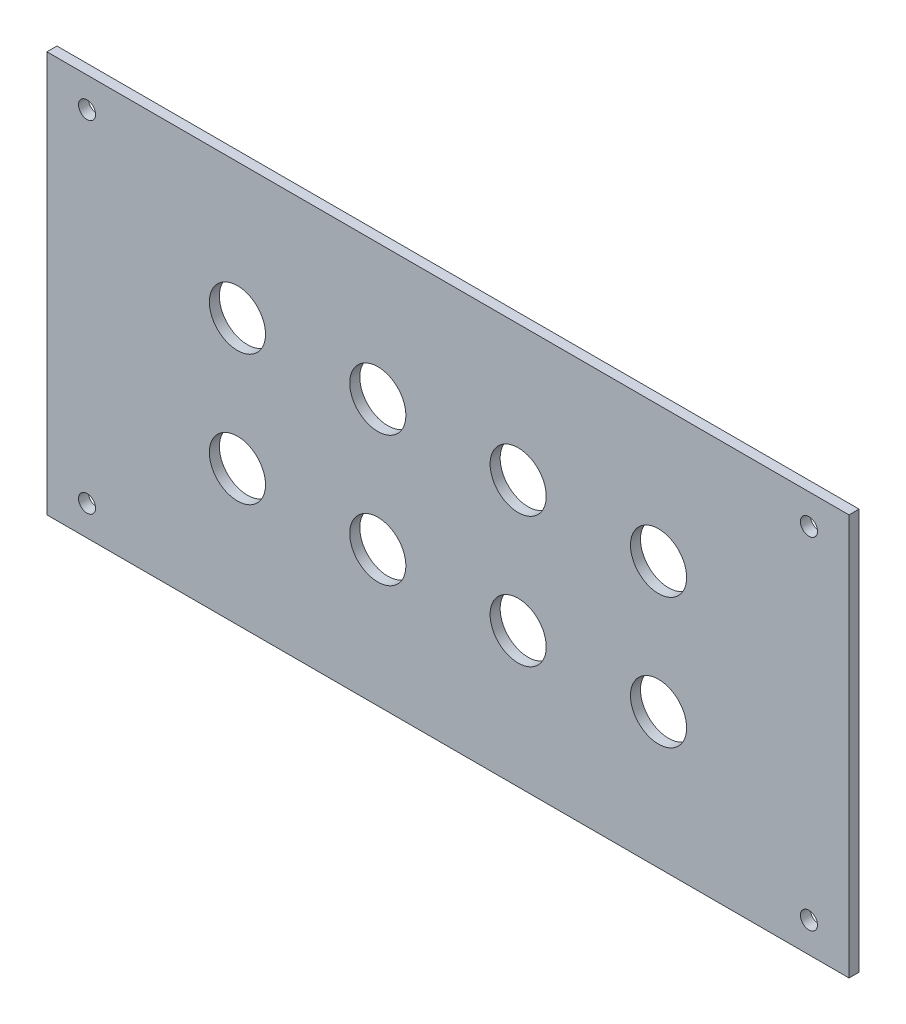
ISO-10303-21;
HEADER;
FILE_DESCRIPTION(('STEP AP214'),'2;1');
FILE_NAME('part.step','',(''),(''),'','','');
FILE_SCHEMA(('AUTOMOTIVE_DESIGN { 1 0 10303 214 1 1 1 1 }'));
ENDSEC;
DATA;
#1=APPLICATION_CONTEXT('core data for automotive mechanical design processes');
#2=APPLICATION_PROTOCOL_DEFINITION('international standard','automotive_design',2000,#1);
#3=PRODUCT_CONTEXT('',#1,'mechanical');
#4=PRODUCT('Part','Part','',(#3));
#5=PRODUCT_RELATED_PRODUCT_CATEGORY('part','',(#4));
#6=PRODUCT_DEFINITION_FORMATION('','',#4);
#7=PRODUCT_DEFINITION_CONTEXT('part definition',#1,'design');
#8=PRODUCT_DEFINITION('design','',#6,#7);
#9=PRODUCT_DEFINITION_SHAPE('','',#8);
#10=(LENGTH_UNIT() NAMED_UNIT(*) SI_UNIT(.MILLI.,.METRE.));
#11=(NAMED_UNIT(*) PLANE_ANGLE_UNIT() SI_UNIT($,.RADIAN.));
#12=(NAMED_UNIT(*) SI_UNIT($,.STERADIAN.) SOLID_ANGLE_UNIT());
#13=UNCERTAINTY_MEASURE_WITH_UNIT(LENGTH_MEASURE(1.E-05),#10,'distance_accuracy_value','');
#14=(GEOMETRIC_REPRESENTATION_CONTEXT(3) GLOBAL_UNCERTAINTY_ASSIGNED_CONTEXT((#13)) GLOBAL_UNIT_ASSIGNED_CONTEXT((#10,
#11,#12)) REPRESENTATION_CONTEXT('',''));
#15=CARTESIAN_POINT('',(0.,0.,0.));
#16=DIRECTION('',(0.,0.,1.));
#17=DIRECTION('',(1.,0.,0.));
#18=AXIS2_PLACEMENT_3D('',#15,#16,#17);
#19=CARTESIAN_POINT('',(0.,0.,2.));
#20=DIRECTION('',(0.,0.,1.));
#21=DIRECTION('',(1.,0.,0.));
#22=AXIS2_PLACEMENT_3D('',#19,#20,#21);
#23=PLANE('',#22);
#24=CARTESIAN_POINT('',(72.,34.,2.));
#25=DIRECTION('',(0.,0.,1.));
#26=DIRECTION('',(1.,0.,0.));
#27=AXIS2_PLACEMENT_3D('',#24,#25,#26);
#28=CIRCLE('',#27,1.7);
#29=CARTESIAN_POINT('',(73.7,34.,2.));
#30=VERTEX_POINT('',#29);
#31=EDGE_CURVE('E134',#30,#30,#28,.T.);
#32=ORIENTED_EDGE('',*,*,#31,.F.);
#33=EDGE_LOOP('',(#32));
#34=FACE_BOUND('',#33,.T.);
#35=CARTESIAN_POINT('',(72.,-34.,2.));
#36=DIRECTION('',(0.,0.,1.));
#37=DIRECTION('',(1.,0.,0.));
#38=AXIS2_PLACEMENT_3D('',#35,#36,#37);
#39=CIRCLE('',#38,1.7);
#40=CARTESIAN_POINT('',(73.7,-34.,2.));
#41=VERTEX_POINT('',#40);
#42=EDGE_CURVE('E131',#41,#41,#39,.T.);
#43=ORIENTED_EDGE('',*,*,#42,.F.);
#44=EDGE_LOOP('',(#43));
#45=FACE_BOUND('',#44,.T.);
#46=CARTESIAN_POINT('',(-72.,34.,2.));
#47=DIRECTION('',(0.,0.,1.));
#48=DIRECTION('',(1.,0.,0.));
#49=AXIS2_PLACEMENT_3D('',#46,#47,#48);
#50=CIRCLE('',#49,1.7);
#51=CARTESIAN_POINT('',(-70.3,34.,2.));
#52=VERTEX_POINT('',#51);
#53=EDGE_CURVE('E128',#52,#52,#50,.T.);
#54=ORIENTED_EDGE('',*,*,#53,.F.);
#55=EDGE_LOOP('',(#54));
#56=FACE_BOUND('',#55,.T.);
#57=CARTESIAN_POINT('',(-72.,-34.,2.));
#58=DIRECTION('',(0.,0.,1.));
#59=DIRECTION('',(1.,0.,0.));
#60=AXIS2_PLACEMENT_3D('',#57,#58,#59);
#61=CIRCLE('',#60,1.7);
#62=CARTESIAN_POINT('',(-70.3,-34.,2.));
#63=VERTEX_POINT('',#62);
#64=EDGE_CURVE('E124',#63,#63,#61,.T.);
#65=ORIENTED_EDGE('',*,*,#64,.F.);
#66=EDGE_LOOP('',(#65));
#67=FACE_BOUND('',#66,.T.);
#68=CARTESIAN_POINT('',(42.,13.,2.));
#69=DIRECTION('',(0.,0.,1.));
#70=DIRECTION('',(1.,0.,0.));
#71=AXIS2_PLACEMENT_3D('',#68,#69,#70);
#72=CIRCLE('',#71,5.6);
#73=CARTESIAN_POINT('',(47.6,13.,2.));
#74=VERTEX_POINT('',#73);
#75=EDGE_CURVE('E120',#74,#74,#72,.T.);
#76=ORIENTED_EDGE('',*,*,#75,.F.);
#77=EDGE_LOOP('',(#76));
#78=FACE_BOUND('',#77,.T.);
#79=CARTESIAN_POINT('',(14.,13.,2.));
#80=DIRECTION('',(0.,0.,1.));
#81=DIRECTION('',(1.,0.,0.));
#82=AXIS2_PLACEMENT_3D('',#79,#80,#81);
#83=CIRCLE('',#82,5.6);
#84=CARTESIAN_POINT('',(19.6,13.,2.));
#85=VERTEX_POINT('',#84);
#86=EDGE_CURVE('E116',#85,#85,#83,.T.);
#87=ORIENTED_EDGE('',*,*,#86,.F.);
#88=EDGE_LOOP('',(#87));
#89=FACE_BOUND('',#88,.T.);
#90=CARTESIAN_POINT('',(-14.,13.,2.));
#91=DIRECTION('',(0.,0.,1.));
#92=DIRECTION('',(1.,0.,0.));
#93=AXIS2_PLACEMENT_3D('',#90,#91,#92);
#94=CIRCLE('',#93,5.6);
#95=CARTESIAN_POINT('',(-8.4,13.,2.));
#96=VERTEX_POINT('',#95);
#97=EDGE_CURVE('E112',#96,#96,#94,.T.);
#98=ORIENTED_EDGE('',*,*,#97,.F.);
#99=EDGE_LOOP('',(#98));
#100=FACE_BOUND('',#99,.T.);
#101=CARTESIAN_POINT('',(-42.,13.,2.));
#102=DIRECTION('',(0.,0.,1.));
#103=DIRECTION('',(1.,0.,0.));
#104=AXIS2_PLACEMENT_3D('',#101,#102,#103);
#105=CIRCLE('',#104,5.6);
#106=CARTESIAN_POINT('',(-36.4,13.,2.));
#107=VERTEX_POINT('',#106);
#108=EDGE_CURVE('E108',#107,#107,#105,.T.);
#109=ORIENTED_EDGE('',*,*,#108,.F.);
#110=EDGE_LOOP('',(#109));
#111=FACE_BOUND('',#110,.T.);
#112=CARTESIAN_POINT('',(42.,-13.,2.));
#113=DIRECTION('',(0.,0.,1.));
#114=DIRECTION('',(1.,0.,0.));
#115=AXIS2_PLACEMENT_3D('',#112,#113,#114);
#116=CIRCLE('',#115,5.6);
#117=CARTESIAN_POINT('',(47.6,-13.,2.));
#118=VERTEX_POINT('',#117);
#119=EDGE_CURVE('E104',#118,#118,#116,.T.);
#120=ORIENTED_EDGE('',*,*,#119,.F.);
#121=EDGE_LOOP('',(#120));
#122=FACE_BOUND('',#121,.T.);
#123=CARTESIAN_POINT('',(14.,-13.,2.));
#124=DIRECTION('',(0.,0.,1.));
#125=DIRECTION('',(1.,0.,0.));
#126=AXIS2_PLACEMENT_3D('',#123,#124,#125);
#127=CIRCLE('',#126,5.6);
#128=CARTESIAN_POINT('',(19.6,-13.,2.));
#129=VERTEX_POINT('',#128);
#130=EDGE_CURVE('E100',#129,#129,#127,.T.);
#131=ORIENTED_EDGE('',*,*,#130,.F.);
#132=EDGE_LOOP('',(#131));
#133=FACE_BOUND('',#132,.T.);
#134=CARTESIAN_POINT('',(-14.,-13.,2.));
#135=DIRECTION('',(0.,0.,1.));
#136=DIRECTION('',(1.,0.,0.));
#137=AXIS2_PLACEMENT_3D('',#134,#135,#136);
#138=CIRCLE('',#137,5.6);
#139=CARTESIAN_POINT('',(-8.4,-13.,2.));
#140=VERTEX_POINT('',#139);
#141=EDGE_CURVE('E96',#140,#140,#138,.T.);
#142=ORIENTED_EDGE('',*,*,#141,.F.);
#143=EDGE_LOOP('',(#142));
#144=FACE_BOUND('',#143,.T.);
#145=CARTESIAN_POINT('',(-42.,-13.,2.));
#146=DIRECTION('',(0.,0.,1.));
#147=DIRECTION('',(1.,0.,0.));
#148=AXIS2_PLACEMENT_3D('',#145,#146,#147);
#149=CIRCLE('',#148,5.6);
#150=CARTESIAN_POINT('',(-36.4,-13.,2.));
#151=VERTEX_POINT('',#150);
#152=EDGE_CURVE('E73',#151,#151,#149,.T.);
#153=ORIENTED_EDGE('',*,*,#152,.F.);
#154=EDGE_LOOP('',(#153));
#155=FACE_BOUND('',#154,.T.);
#156=DIRECTION('',(-1.,0.,0.));
#157=VECTOR('',#156,1.);
#158=CARTESIAN_POINT('',(0.,-40.,2.));
#159=LINE('',#158,#157);
#160=CARTESIAN_POINT('',(80.,-40.,2.));
#161=VERTEX_POINT('',#160);
#162=CARTESIAN_POINT('',(-80.,-40.,2.));
#163=VERTEX_POINT('',#162);
#164=EDGE_CURVE('E10',#161,#163,#159,.T.);
#165=ORIENTED_EDGE('',*,*,#164,.F.);
#166=DIRECTION('',(0.,-1.,0.));
#167=VECTOR('',#166,1.);
#168=CARTESIAN_POINT('',(80.,0.,2.));
#169=LINE('',#168,#167);
#170=CARTESIAN_POINT('',(80.,40.,2.));
#171=VERTEX_POINT('',#170);
#172=EDGE_CURVE('E62',#171,#161,#169,.T.);
#173=ORIENTED_EDGE('',*,*,#172,.F.);
#174=DIRECTION('',(1.,0.,0.));
#175=VECTOR('',#174,1.);
#176=CARTESIAN_POINT('',(0.,40.,2.));
#177=LINE('',#176,#175);
#178=CARTESIAN_POINT('',(-80.,40.,2.));
#179=VERTEX_POINT('',#178);
#180=EDGE_CURVE('E90',#179,#171,#177,.T.);
#181=ORIENTED_EDGE('',*,*,#180,.F.);
#182=DIRECTION('',(0.,1.,0.));
#183=VECTOR('',#182,1.);
#184=CARTESIAN_POINT('',(-80.,0.,2.));
#185=LINE('',#184,#183);
#186=EDGE_CURVE('E24',#163,#179,#185,.T.);
#187=ORIENTED_EDGE('',*,*,#186,.F.);
#188=EDGE_LOOP('',(#165,#173,#181,#187));
#189=FACE_BOUND('',#188,.T.);
#190=ADVANCED_FACE('F16',(#34,#45,#56,#67,#78,#89,#100,#111,#122,#133,#144,#155,#189),#23,.T.);
#191=CARTESIAN_POINT('',(0.,-40.,0.));
#192=DIRECTION('',(0.,-1.,0.));
#193=DIRECTION('',(0.,0.,-1.));
#194=AXIS2_PLACEMENT_3D('',#191,#192,#193);
#195=PLANE('',#194);
#196=DIRECTION('',(0.,0.,1.));
#197=VECTOR('',#196,1.);
#198=CARTESIAN_POINT('',(80.,-40.,0.));
#199=LINE('',#198,#197);
#200=CARTESIAN_POINT('',(80.,-40.,0.));
#201=VERTEX_POINT('',#200);
#202=EDGE_CURVE('E55',#201,#161,#199,.T.);
#203=ORIENTED_EDGE('',*,*,#202,.T.);
#204=ORIENTED_EDGE('',*,*,#164,.T.);
#205=DIRECTION('',(0.,0.,1.));
#206=VECTOR('',#205,1.);
#207=CARTESIAN_POINT('',(-80.,-40.,0.));
#208=LINE('',#207,#206);
#209=CARTESIAN_POINT('',(-80.,-40.,0.));
#210=VERTEX_POINT('',#209);
#211=EDGE_CURVE('E68',#210,#163,#208,.T.);
#212=ORIENTED_EDGE('',*,*,#211,.F.);
#213=DIRECTION('',(1.,0.,0.));
#214=VECTOR('',#213,1.);
#215=CARTESIAN_POINT('',(0.,-40.,0.));
#216=LINE('',#215,#214);
#217=EDGE_CURVE('E66',#210,#201,#216,.T.);
#218=ORIENTED_EDGE('',*,*,#217,.T.);
#219=EDGE_LOOP('',(#203,#204,#212,#218));
#220=FACE_BOUND('',#219,.T.);
#221=ADVANCED_FACE('F67',(#220),#195,.T.);
#222=CARTESIAN_POINT('',(-80.,0.,0.));
#223=DIRECTION('',(-1.,0.,0.));
#224=DIRECTION('',(0.,0.,1.));
#225=AXIS2_PLACEMENT_3D('',#222,#223,#224);
#226=PLANE('',#225);
#227=ORIENTED_EDGE('',*,*,#211,.T.);
#228=ORIENTED_EDGE('',*,*,#186,.T.);
#229=DIRECTION('',(0.,0.,1.));
#230=VECTOR('',#229,1.);
#231=CARTESIAN_POINT('',(-80.,40.,0.));
#232=LINE('',#231,#230);
#233=CARTESIAN_POINT('',(-80.,40.,0.));
#234=VERTEX_POINT('',#233);
#235=EDGE_CURVE('E85',#234,#179,#232,.T.);
#236=ORIENTED_EDGE('',*,*,#235,.F.);
#237=DIRECTION('',(0.,-1.,0.));
#238=VECTOR('',#237,1.);
#239=CARTESIAN_POINT('',(-80.,0.,0.));
#240=LINE('',#239,#238);
#241=EDGE_CURVE('E72',#234,#210,#240,.T.);
#242=ORIENTED_EDGE('',*,*,#241,.T.);
#243=EDGE_LOOP('',(#227,#228,#236,#242));
#244=FACE_BOUND('',#243,.T.);
#245=ADVANCED_FACE('F171',(#244),#226,.T.);
#246=CARTESIAN_POINT('',(0.,40.,0.));
#247=DIRECTION('',(0.,1.,0.));
#248=DIRECTION('',(0.,0.,1.));
#249=AXIS2_PLACEMENT_3D('',#246,#247,#248);
#250=PLANE('',#249);
#251=ORIENTED_EDGE('',*,*,#235,.T.);
#252=ORIENTED_EDGE('',*,*,#180,.T.);
#253=DIRECTION('',(0.,0.,1.));
#254=VECTOR('',#253,1.);
#255=CARTESIAN_POINT('',(80.,40.,0.));
#256=LINE('',#255,#254);
#257=CARTESIAN_POINT('',(80.,40.,0.));
#258=VERTEX_POINT('',#257);
#259=EDGE_CURVE('E63',#258,#171,#256,.T.);
#260=ORIENTED_EDGE('',*,*,#259,.F.);
#261=DIRECTION('',(-1.,0.,0.));
#262=VECTOR('',#261,1.);
#263=CARTESIAN_POINT('',(0.,40.,0.));
#264=LINE('',#263,#262);
#265=EDGE_CURVE('E78',#258,#234,#264,.T.);
#266=ORIENTED_EDGE('',*,*,#265,.T.);
#267=EDGE_LOOP('',(#251,#252,#260,#266));
#268=FACE_BOUND('',#267,.T.);
#269=ADVANCED_FACE('F173',(#268),#250,.T.);
#270=CARTESIAN_POINT('',(0.,0.,0.));
#271=DIRECTION('',(0.,0.,-1.));
#272=DIRECTION('',(-1.,0.,0.));
#273=AXIS2_PLACEMENT_3D('',#270,#271,#272);
#274=PLANE('',#273);
#275=CARTESIAN_POINT('',(72.,34.,0.));
#276=DIRECTION('',(0.,0.,-1.));
#277=DIRECTION('',(-1.,0.,0.));
#278=AXIS2_PLACEMENT_3D('',#275,#276,#277);
#279=CIRCLE('',#278,1.7);
#280=CARTESIAN_POINT('',(70.3,34.,0.));
#281=VERTEX_POINT('',#280);
#282=EDGE_CURVE('E19',#281,#281,#279,.T.);
#283=ORIENTED_EDGE('',*,*,#282,.F.);
#284=EDGE_LOOP('',(#283));
#285=FACE_BOUND('',#284,.T.);
#286=CARTESIAN_POINT('',(72.,-34.,0.));
#287=DIRECTION('',(0.,0.,-1.));
#288=DIRECTION('',(-1.,0.,0.));
#289=AXIS2_PLACEMENT_3D('',#286,#287,#288);
#290=CIRCLE('',#289,1.7);
#291=CARTESIAN_POINT('',(70.3,-34.,0.));
#292=VERTEX_POINT('',#291);
#293=EDGE_CURVE('E132',#292,#292,#290,.T.);
#294=ORIENTED_EDGE('',*,*,#293,.F.);
#295=EDGE_LOOP('',(#294));
#296=FACE_BOUND('',#295,.T.);
#297=CARTESIAN_POINT('',(-72.,34.,0.));
#298=DIRECTION('',(0.,0.,-1.));
#299=DIRECTION('',(-1.,0.,0.));
#300=AXIS2_PLACEMENT_3D('',#297,#298,#299);
#301=CIRCLE('',#300,1.7);
#302=CARTESIAN_POINT('',(-73.7,34.,0.));
#303=VERTEX_POINT('',#302);
#304=EDGE_CURVE('E129',#303,#303,#301,.T.);
#305=ORIENTED_EDGE('',*,*,#304,.F.);
#306=EDGE_LOOP('',(#305));
#307=FACE_BOUND('',#306,.T.);
#308=CARTESIAN_POINT('',(-72.,-34.,0.));
#309=DIRECTION('',(0.,0.,-1.));
#310=DIRECTION('',(-1.,0.,0.));
#311=AXIS2_PLACEMENT_3D('',#308,#309,#310);
#312=CIRCLE('',#311,1.7);
#313=CARTESIAN_POINT('',(-73.7,-34.,0.));
#314=VERTEX_POINT('',#313);
#315=EDGE_CURVE('E125',#314,#314,#312,.T.);
#316=ORIENTED_EDGE('',*,*,#315,.F.);
#317=EDGE_LOOP('',(#316));
#318=FACE_BOUND('',#317,.T.);
#319=CARTESIAN_POINT('',(42.,13.,0.));
#320=DIRECTION('',(0.,0.,-1.));
#321=DIRECTION('',(-1.,0.,0.));
#322=AXIS2_PLACEMENT_3D('',#319,#320,#321);
#323=CIRCLE('',#322,5.6);
#324=CARTESIAN_POINT('',(36.4,13.,0.));
#325=VERTEX_POINT('',#324);
#326=EDGE_CURVE('E121',#325,#325,#323,.T.);
#327=ORIENTED_EDGE('',*,*,#326,.F.);
#328=EDGE_LOOP('',(#327));
#329=FACE_BOUND('',#328,.T.);
#330=CARTESIAN_POINT('',(14.,13.,0.));
#331=DIRECTION('',(0.,0.,-1.));
#332=DIRECTION('',(-1.,0.,0.));
#333=AXIS2_PLACEMENT_3D('',#330,#331,#332);
#334=CIRCLE('',#333,5.6);
#335=CARTESIAN_POINT('',(8.4,13.,0.));
#336=VERTEX_POINT('',#335);
#337=EDGE_CURVE('E117',#336,#336,#334,.T.);
#338=ORIENTED_EDGE('',*,*,#337,.F.);
#339=EDGE_LOOP('',(#338));
#340=FACE_BOUND('',#339,.T.);
#341=CARTESIAN_POINT('',(-14.,13.,0.));
#342=DIRECTION('',(0.,0.,-1.));
#343=DIRECTION('',(-1.,0.,0.));
#344=AXIS2_PLACEMENT_3D('',#341,#342,#343);
#345=CIRCLE('',#344,5.6);
#346=CARTESIAN_POINT('',(-19.6,13.,0.));
#347=VERTEX_POINT('',#346);
#348=EDGE_CURVE('E113',#347,#347,#345,.T.);
#349=ORIENTED_EDGE('',*,*,#348,.F.);
#350=EDGE_LOOP('',(#349));
#351=FACE_BOUND('',#350,.T.);
#352=CARTESIAN_POINT('',(-42.,13.,0.));
#353=DIRECTION('',(0.,0.,-1.));
#354=DIRECTION('',(-1.,0.,0.));
#355=AXIS2_PLACEMENT_3D('',#352,#353,#354);
#356=CIRCLE('',#355,5.6);
#357=CARTESIAN_POINT('',(-47.6,13.,0.));
#358=VERTEX_POINT('',#357);
#359=EDGE_CURVE('E109',#358,#358,#356,.T.);
#360=ORIENTED_EDGE('',*,*,#359,.F.);
#361=EDGE_LOOP('',(#360));
#362=FACE_BOUND('',#361,.T.);
#363=CARTESIAN_POINT('',(42.,-13.,0.));
#364=DIRECTION('',(0.,0.,-1.));
#365=DIRECTION('',(-1.,0.,0.));
#366=AXIS2_PLACEMENT_3D('',#363,#364,#365);
#367=CIRCLE('',#366,5.6);
#368=CARTESIAN_POINT('',(36.4,-13.,0.));
#369=VERTEX_POINT('',#368);
#370=EDGE_CURVE('E105',#369,#369,#367,.T.);
#371=ORIENTED_EDGE('',*,*,#370,.F.);
#372=EDGE_LOOP('',(#371));
#373=FACE_BOUND('',#372,.T.);
#374=CARTESIAN_POINT('',(14.,-13.,0.));
#375=DIRECTION('',(0.,0.,-1.));
#376=DIRECTION('',(-1.,0.,0.));
#377=AXIS2_PLACEMENT_3D('',#374,#375,#376);
#378=CIRCLE('',#377,5.6);
#379=CARTESIAN_POINT('',(8.4,-13.,0.));
#380=VERTEX_POINT('',#379);
#381=EDGE_CURVE('E101',#380,#380,#378,.T.);
#382=ORIENTED_EDGE('',*,*,#381,.F.);
#383=EDGE_LOOP('',(#382));
#384=FACE_BOUND('',#383,.T.);
#385=CARTESIAN_POINT('',(-14.,-13.,0.));
#386=DIRECTION('',(0.,0.,-1.));
#387=DIRECTION('',(-1.,0.,0.));
#388=AXIS2_PLACEMENT_3D('',#385,#386,#387);
#389=CIRCLE('',#388,5.6);
#390=CARTESIAN_POINT('',(-19.6,-13.,0.));
#391=VERTEX_POINT('',#390);
#392=EDGE_CURVE('E97',#391,#391,#389,.T.);
#393=ORIENTED_EDGE('',*,*,#392,.F.);
#394=EDGE_LOOP('',(#393));
#395=FACE_BOUND('',#394,.T.);
#396=CARTESIAN_POINT('',(-42.,-13.,0.));
#397=DIRECTION('',(0.,0.,-1.));
#398=DIRECTION('',(-1.,0.,0.));
#399=AXIS2_PLACEMENT_3D('',#396,#397,#398);
#400=CIRCLE('',#399,5.6);
#401=CARTESIAN_POINT('',(-47.6,-13.,0.));
#402=VERTEX_POINT('',#401);
#403=EDGE_CURVE('E93',#402,#402,#400,.T.);
#404=ORIENTED_EDGE('',*,*,#403,.F.);
#405=EDGE_LOOP('',(#404));
#406=FACE_BOUND('',#405,.T.);
#407=DIRECTION('',(0.,1.,0.));
#408=VECTOR('',#407,1.);
#409=CARTESIAN_POINT('',(80.,0.,0.));
#410=LINE('',#409,#408);
#411=EDGE_CURVE('E60',#201,#258,#410,.T.);
#412=ORIENTED_EDGE('',*,*,#411,.F.);
#413=ORIENTED_EDGE('',*,*,#217,.F.);
#414=ORIENTED_EDGE('',*,*,#241,.F.);
#415=ORIENTED_EDGE('',*,*,#265,.F.);
#416=EDGE_LOOP('',(#412,#413,#414,#415));
#417=FACE_BOUND('',#416,.T.);
#418=ADVANCED_FACE('F76',(#285,#296,#307,#318,#329,#340,#351,#362,#373,#384,#395,#406,#417),
#274,.T.);
#419=CARTESIAN_POINT('',(80.,0.,0.));
#420=DIRECTION('',(1.,0.,0.));
#421=DIRECTION('',(0.,0.,-1.));
#422=AXIS2_PLACEMENT_3D('',#419,#420,#421);
#423=PLANE('',#422);
#424=ORIENTED_EDGE('',*,*,#411,.T.);
#425=ORIENTED_EDGE('',*,*,#259,.T.);
#426=ORIENTED_EDGE('',*,*,#172,.T.);
#427=ORIENTED_EDGE('',*,*,#202,.F.);
#428=EDGE_LOOP('',(#424,#425,#426,#427));
#429=FACE_BOUND('',#428,.T.);
#430=ADVANCED_FACE('F57',(#429),#423,.T.);
#431=CARTESIAN_POINT('',(-42.,-13.,-0.3));
#432=DIRECTION('',(0.,0.,1.));
#433=DIRECTION('',(1.,0.,0.));
#434=AXIS2_PLACEMENT_3D('',#431,#432,#433);
#435=CYLINDRICAL_SURFACE('',#434,5.6);
#436=ORIENTED_EDGE('',*,*,#152,.T.);
#437=EDGE_LOOP('',(#436));
#438=FACE_BOUND('',#437,.T.);
#439=ORIENTED_EDGE('',*,*,#403,.T.);
#440=EDGE_LOOP('',(#439));
#441=FACE_BOUND('',#440,.T.);
#442=ADVANCED_FACE('F165',(#438,#441),#435,.F.);
#443=CARTESIAN_POINT('',(-14.,-13.,-0.3));
#444=DIRECTION('',(0.,0.,1.));
#445=DIRECTION('',(1.,0.,0.));
#446=AXIS2_PLACEMENT_3D('',#443,#444,#445);
#447=CYLINDRICAL_SURFACE('',#446,5.6);
#448=ORIENTED_EDGE('',*,*,#141,.T.);
#449=EDGE_LOOP('',(#448));
#450=FACE_BOUND('',#449,.T.);
#451=ORIENTED_EDGE('',*,*,#392,.T.);
#452=EDGE_LOOP('',(#451));
#453=FACE_BOUND('',#452,.T.);
#454=ADVANCED_FACE('F228',(#450,#453),#447,.F.);
#455=CARTESIAN_POINT('',(14.,-13.,-0.3));
#456=DIRECTION('',(0.,0.,1.));
#457=DIRECTION('',(1.,0.,0.));
#458=AXIS2_PLACEMENT_3D('',#455,#456,#457);
#459=CYLINDRICAL_SURFACE('',#458,5.6);
#460=ORIENTED_EDGE('',*,*,#130,.T.);
#461=EDGE_LOOP('',(#460));
#462=FACE_BOUND('',#461,.T.);
#463=ORIENTED_EDGE('',*,*,#381,.T.);
#464=EDGE_LOOP('',(#463));
#465=FACE_BOUND('',#464,.T.);
#466=ADVANCED_FACE('F237',(#462,#465),#459,.F.);
#467=CARTESIAN_POINT('',(42.,-13.,-0.3));
#468=DIRECTION('',(0.,0.,1.));
#469=DIRECTION('',(1.,0.,0.));
#470=AXIS2_PLACEMENT_3D('',#467,#468,#469);
#471=CYLINDRICAL_SURFACE('',#470,5.6);
#472=ORIENTED_EDGE('',*,*,#119,.T.);
#473=EDGE_LOOP('',(#472));
#474=FACE_BOUND('',#473,.T.);
#475=ORIENTED_EDGE('',*,*,#370,.T.);
#476=EDGE_LOOP('',(#475));
#477=FACE_BOUND('',#476,.T.);
#478=ADVANCED_FACE('F247',(#474,#477),#471,.F.);
#479=CARTESIAN_POINT('',(-42.,13.,-0.3));
#480=DIRECTION('',(0.,0.,1.));
#481=DIRECTION('',(1.,0.,0.));
#482=AXIS2_PLACEMENT_3D('',#479,#480,#481);
#483=CYLINDRICAL_SURFACE('',#482,5.6);
#484=ORIENTED_EDGE('',*,*,#108,.T.);
#485=EDGE_LOOP('',(#484));
#486=FACE_BOUND('',#485,.T.);
#487=ORIENTED_EDGE('',*,*,#359,.T.);
#488=EDGE_LOOP('',(#487));
#489=FACE_BOUND('',#488,.T.);
#490=ADVANCED_FACE('F257',(#486,#489),#483,.F.);
#491=CARTESIAN_POINT('',(-14.,13.,-0.3));
#492=DIRECTION('',(0.,0.,1.));
#493=DIRECTION('',(1.,0.,0.));
#494=AXIS2_PLACEMENT_3D('',#491,#492,#493);
#495=CYLINDRICAL_SURFACE('',#494,5.6);
#496=ORIENTED_EDGE('',*,*,#97,.T.);
#497=EDGE_LOOP('',(#496));
#498=FACE_BOUND('',#497,.T.);
#499=ORIENTED_EDGE('',*,*,#348,.T.);
#500=EDGE_LOOP('',(#499));
#501=FACE_BOUND('',#500,.T.);
#502=ADVANCED_FACE('F267',(#498,#501),#495,.F.);
#503=CARTESIAN_POINT('',(14.,13.,-0.3));
#504=DIRECTION('',(0.,0.,1.));
#505=DIRECTION('',(1.,0.,0.));
#506=AXIS2_PLACEMENT_3D('',#503,#504,#505);
#507=CYLINDRICAL_SURFACE('',#506,5.6);
#508=ORIENTED_EDGE('',*,*,#86,.T.);
#509=EDGE_LOOP('',(#508));
#510=FACE_BOUND('',#509,.T.);
#511=ORIENTED_EDGE('',*,*,#337,.T.);
#512=EDGE_LOOP('',(#511));
#513=FACE_BOUND('',#512,.T.);
#514=ADVANCED_FACE('F277',(#510,#513),#507,.F.);
#515=CARTESIAN_POINT('',(42.,13.,-0.3));
#516=DIRECTION('',(0.,0.,1.));
#517=DIRECTION('',(1.,0.,0.));
#518=AXIS2_PLACEMENT_3D('',#515,#516,#517);
#519=CYLINDRICAL_SURFACE('',#518,5.6);
#520=ORIENTED_EDGE('',*,*,#75,.T.);
#521=EDGE_LOOP('',(#520));
#522=FACE_BOUND('',#521,.T.);
#523=ORIENTED_EDGE('',*,*,#326,.T.);
#524=EDGE_LOOP('',(#523));
#525=FACE_BOUND('',#524,.T.);
#526=ADVANCED_FACE('F287',(#522,#525),#519,.F.);
#527=CARTESIAN_POINT('',(-72.,-34.,-0.3));
#528=DIRECTION('',(0.,0.,1.));
#529=DIRECTION('',(1.,0.,0.));
#530=AXIS2_PLACEMENT_3D('',#527,#528,#529);
#531=CYLINDRICAL_SURFACE('',#530,1.7);
#532=ORIENTED_EDGE('',*,*,#64,.T.);
#533=EDGE_LOOP('',(#532));
#534=FACE_BOUND('',#533,.T.);
#535=ORIENTED_EDGE('',*,*,#315,.T.);
#536=EDGE_LOOP('',(#535));
#537=FACE_BOUND('',#536,.T.);
#538=ADVANCED_FACE('F297',(#534,#537),#531,.F.);
#539=CARTESIAN_POINT('',(-72.,34.,-0.3));
#540=DIRECTION('',(0.,0.,1.));
#541=DIRECTION('',(1.,0.,0.));
#542=AXIS2_PLACEMENT_3D('',#539,#540,#541);
#543=CYLINDRICAL_SURFACE('',#542,1.7);
#544=ORIENTED_EDGE('',*,*,#53,.T.);
#545=EDGE_LOOP('',(#544));
#546=FACE_BOUND('',#545,.T.);
#547=ORIENTED_EDGE('',*,*,#304,.T.);
#548=EDGE_LOOP('',(#547));
#549=FACE_BOUND('',#548,.T.);
#550=ADVANCED_FACE('F307',(#546,#549),#543,.F.);
#551=CARTESIAN_POINT('',(72.,-34.,-0.3));
#552=DIRECTION('',(0.,0.,1.));
#553=DIRECTION('',(1.,0.,0.));
#554=AXIS2_PLACEMENT_3D('',#551,#552,#553);
#555=CYLINDRICAL_SURFACE('',#554,1.7);
#556=ORIENTED_EDGE('',*,*,#42,.T.);
#557=EDGE_LOOP('',(#556));
#558=FACE_BOUND('',#557,.T.);
#559=ORIENTED_EDGE('',*,*,#293,.T.);
#560=EDGE_LOOP('',(#559));
#561=FACE_BOUND('',#560,.T.);
#562=ADVANCED_FACE('F317',(#558,#561),#555,.F.);
#563=CARTESIAN_POINT('',(72.,34.,-0.3));
#564=DIRECTION('',(0.,0.,1.));
#565=DIRECTION('',(1.,0.,0.));
#566=AXIS2_PLACEMENT_3D('',#563,#564,#565);
#567=CYLINDRICAL_SURFACE('',#566,1.7);
#568=ORIENTED_EDGE('',*,*,#31,.T.);
#569=EDGE_LOOP('',(#568));
#570=FACE_BOUND('',#569,.T.);
#571=ORIENTED_EDGE('',*,*,#282,.T.);
#572=EDGE_LOOP('',(#571));
#573=FACE_BOUND('',#572,.T.);
#574=ADVANCED_FACE('F327',(#570,#573),#567,.F.);
#575=CLOSED_SHELL('',(#190,#221,#245,#269,#418,#430,#442,#454,#466,#478,#490,#502,#514,#526,
#538,#550,#562,#574));
#576=MANIFOLD_SOLID_BREP('B1',#575);
#577=ADVANCED_BREP_SHAPE_REPRESENTATION('',(#18,#576),#14);
#578=SHAPE_DEFINITION_REPRESENTATION(#9,#577);
ENDSEC;
END-ISO-10303-21;
